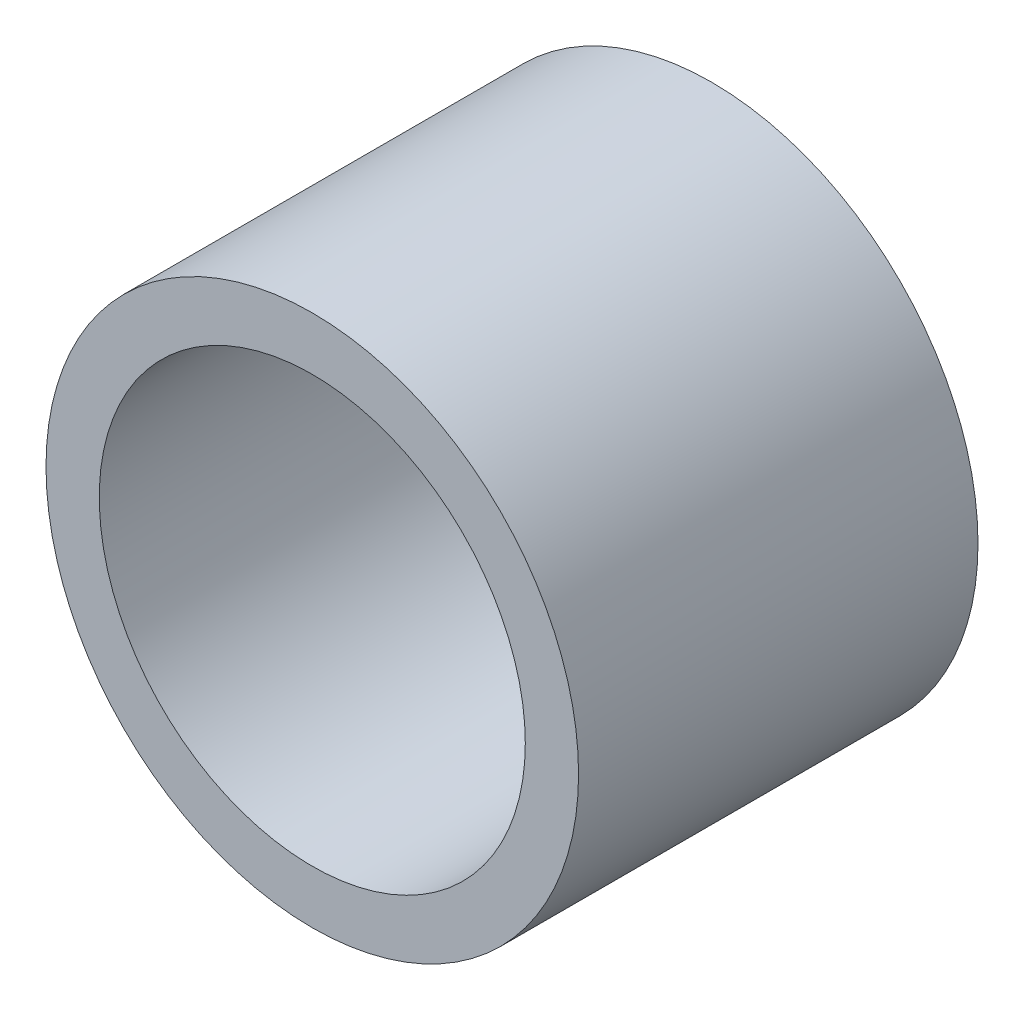
ISO-10303-21;
HEADER;
FILE_DESCRIPTION(('STEP AP214'),'2;1');
FILE_NAME('part.step','',(''),(''),'','','');
FILE_SCHEMA(('AUTOMOTIVE_DESIGN { 1 0 10303 214 1 1 1 1 }'));
ENDSEC;
DATA;
#1=APPLICATION_CONTEXT('core data for automotive mechanical design processes');
#2=APPLICATION_PROTOCOL_DEFINITION('international standard','automotive_design',2000,#1);
#3=PRODUCT_CONTEXT('',#1,'mechanical');
#4=PRODUCT('Part','Part','',(#3));
#5=PRODUCT_RELATED_PRODUCT_CATEGORY('part','',(#4));
#6=PRODUCT_DEFINITION_FORMATION('','',#4);
#7=PRODUCT_DEFINITION_CONTEXT('part definition',#1,'design');
#8=PRODUCT_DEFINITION('design','',#6,#7);
#9=PRODUCT_DEFINITION_SHAPE('','',#8);
#10=(LENGTH_UNIT() NAMED_UNIT(*) SI_UNIT(.MILLI.,.METRE.));
#11=(NAMED_UNIT(*) PLANE_ANGLE_UNIT() SI_UNIT($,.RADIAN.));
#12=(NAMED_UNIT(*) SI_UNIT($,.STERADIAN.) SOLID_ANGLE_UNIT());
#13=UNCERTAINTY_MEASURE_WITH_UNIT(LENGTH_MEASURE(1.E-05),#10,'distance_accuracy_value','');
#14=(GEOMETRIC_REPRESENTATION_CONTEXT(3) GLOBAL_UNCERTAINTY_ASSIGNED_CONTEXT((#13)) GLOBAL_UNIT_ASSIGNED_CONTEXT((#10,
#11,#12)) REPRESENTATION_CONTEXT('',''));
#15=CARTESIAN_POINT('',(0.,0.,0.));
#16=DIRECTION('',(0.,0.,1.));
#17=DIRECTION('',(1.,0.,0.));
#18=AXIS2_PLACEMENT_3D('',#15,#16,#17);
#19=CARTESIAN_POINT('',(0.,0.,3.));
#20=DIRECTION('',(0.,0.,1.));
#21=DIRECTION('',(1.,0.,0.));
#22=AXIS2_PLACEMENT_3D('',#19,#20,#21);
#23=PLANE('',#22);
#24=CARTESIAN_POINT('',(0.,0.,3.));
#25=DIRECTION('',(0.,0.,1.));
#26=DIRECTION('',(1.,0.,0.));
#27=AXIS2_PLACEMENT_3D('',#24,#25,#26);
#28=CIRCLE('',#27,2.);
#29=CARTESIAN_POINT('',(2.,0.,3.));
#30=VERTEX_POINT('',#29);
#31=EDGE_CURVE('E10',#30,#30,#28,.T.);
#32=ORIENTED_EDGE('',*,*,#31,.T.);
#33=EDGE_LOOP('',(#32));
#34=FACE_BOUND('',#33,.T.);
#35=CARTESIAN_POINT('',(0.,0.,3.));
#36=DIRECTION('',(0.,0.,1.));
#37=DIRECTION('',(1.,0.,0.));
#38=AXIS2_PLACEMENT_3D('',#35,#36,#37);
#39=CIRCLE('',#38,1.6);
#40=CARTESIAN_POINT('',(1.6,0.,3.));
#41=VERTEX_POINT('',#40);
#42=EDGE_CURVE('E42',#41,#41,#39,.T.);
#43=ORIENTED_EDGE('',*,*,#42,.F.);
#44=EDGE_LOOP('',(#43));
#45=FACE_BOUND('',#44,.T.);
#46=ADVANCED_FACE('F31',(#34,#45),#23,.T.);
#47=CARTESIAN_POINT('',(0.,0.,0.));
#48=DIRECTION('',(0.,0.,1.));
#49=DIRECTION('',(1.,0.,0.));
#50=AXIS2_PLACEMENT_3D('',#47,#48,#49);
#51=PLANE('',#50);
#52=CARTESIAN_POINT('',(0.,0.,0.));
#53=DIRECTION('',(0.,0.,1.));
#54=DIRECTION('',(1.,0.,0.));
#55=AXIS2_PLACEMENT_3D('',#52,#53,#54);
#56=CIRCLE('',#55,2.);
#57=CARTESIAN_POINT('',(2.,0.,0.));
#58=VERTEX_POINT('',#57);
#59=EDGE_CURVE('E35',#58,#58,#56,.T.);
#60=ORIENTED_EDGE('',*,*,#59,.F.);
#61=EDGE_LOOP('',(#60));
#62=FACE_BOUND('',#61,.T.);
#63=CARTESIAN_POINT('',(0.,0.,0.));
#64=DIRECTION('',(0.,0.,1.));
#65=DIRECTION('',(1.,0.,0.));
#66=AXIS2_PLACEMENT_3D('',#63,#64,#65);
#67=CIRCLE('',#66,1.6);
#68=CARTESIAN_POINT('',(1.6,0.,0.));
#69=VERTEX_POINT('',#68);
#70=EDGE_CURVE('E44',#69,#69,#67,.T.);
#71=ORIENTED_EDGE('',*,*,#70,.T.);
#72=EDGE_LOOP('',(#71));
#73=FACE_BOUND('',#72,.T.);
#74=ADVANCED_FACE('F54',(#62,#73),#51,.F.);
#75=CARTESIAN_POINT('',(0.,0.,3.));
#76=DIRECTION('',(0.,0.,-1.));
#77=DIRECTION('',(-1.,0.,0.));
#78=AXIS2_PLACEMENT_3D('',#75,#76,#77);
#79=CYLINDRICAL_SURFACE('',#78,2.);
#80=ORIENTED_EDGE('',*,*,#31,.F.);
#81=EDGE_LOOP('',(#80));
#82=FACE_BOUND('',#81,.T.);
#83=ORIENTED_EDGE('',*,*,#59,.T.);
#84=EDGE_LOOP('',(#83));
#85=FACE_BOUND('',#84,.T.);
#86=ADVANCED_FACE('F33',(#82,#85),#79,.T.);
#87=CARTESIAN_POINT('',(0.,0.,3.));
#88=DIRECTION('',(0.,0.,-1.));
#89=DIRECTION('',(-1.,0.,0.));
#90=AXIS2_PLACEMENT_3D('',#87,#88,#89);
#91=CYLINDRICAL_SURFACE('',#90,1.6);
#92=ORIENTED_EDGE('',*,*,#42,.T.);
#93=EDGE_LOOP('',(#92));
#94=FACE_BOUND('',#93,.T.);
#95=ORIENTED_EDGE('',*,*,#70,.F.);
#96=EDGE_LOOP('',(#95));
#97=FACE_BOUND('',#96,.T.);
#98=ADVANCED_FACE('F50',(#94,#97),#91,.F.);
#99=CLOSED_SHELL('',(#46,#74,#86,#98));
#100=MANIFOLD_SOLID_BREP('B2',#99);
#101=ADVANCED_BREP_SHAPE_REPRESENTATION('',(#18,#100),#14);
#102=SHAPE_DEFINITION_REPRESENTATION(#9,#101);
ENDSEC;
END-ISO-10303-21;
